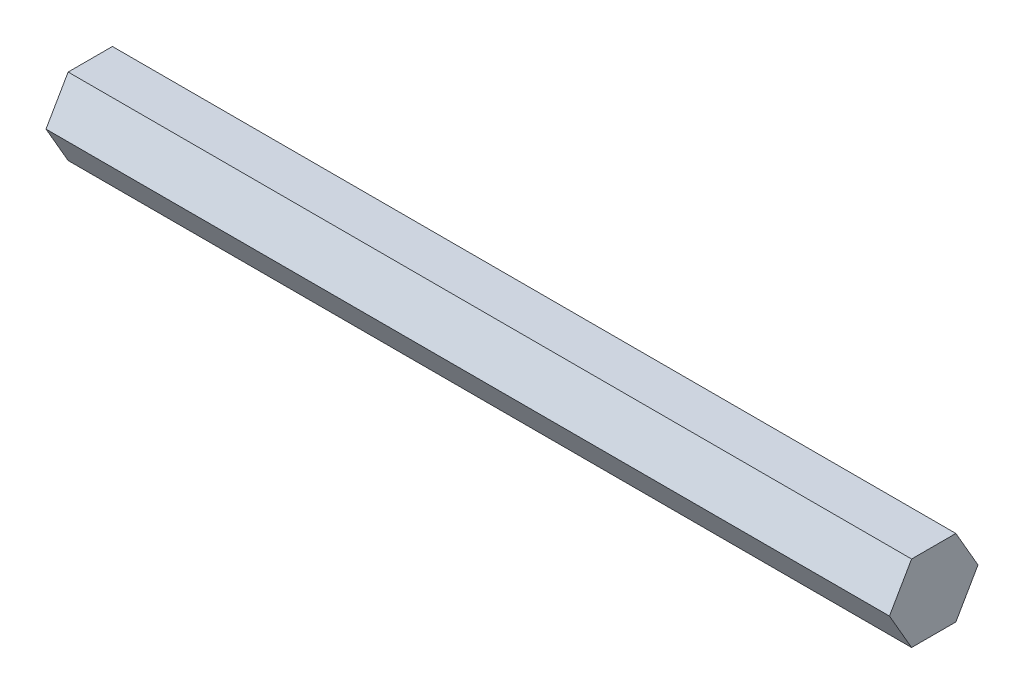
ISO-10303-21;
HEADER;
FILE_DESCRIPTION(('STEP AP214'),'2;1');
FILE_NAME('part.step','',(''),(''),'','','');
FILE_SCHEMA(('AUTOMOTIVE_DESIGN { 1 0 10303 214 1 1 1 1 }'));
ENDSEC;
DATA;
#1=APPLICATION_CONTEXT('core data for automotive mechanical design processes');
#2=APPLICATION_PROTOCOL_DEFINITION('international standard','automotive_design',2000,#1);
#3=PRODUCT_CONTEXT('',#1,'mechanical');
#4=PRODUCT('Part','Part','',(#3));
#5=PRODUCT_RELATED_PRODUCT_CATEGORY('part','',(#4));
#6=PRODUCT_DEFINITION_FORMATION('','',#4);
#7=PRODUCT_DEFINITION_CONTEXT('part definition',#1,'design');
#8=PRODUCT_DEFINITION('design','',#6,#7);
#9=PRODUCT_DEFINITION_SHAPE('','',#8);
#10=(LENGTH_UNIT() NAMED_UNIT(*) SI_UNIT(.MILLI.,.METRE.));
#11=(NAMED_UNIT(*) PLANE_ANGLE_UNIT() SI_UNIT($,.RADIAN.));
#12=(NAMED_UNIT(*) SI_UNIT($,.STERADIAN.) SOLID_ANGLE_UNIT());
#13=UNCERTAINTY_MEASURE_WITH_UNIT(LENGTH_MEASURE(1.E-05),#10,'distance_accuracy_value','');
#14=(GEOMETRIC_REPRESENTATION_CONTEXT(3) GLOBAL_UNCERTAINTY_ASSIGNED_CONTEXT((#13)) GLOBAL_UNIT_ASSIGNED_CONTEXT((#10,
#11,#12)) REPRESENTATION_CONTEXT('',''));
#15=CARTESIAN_POINT('',(0.,0.,0.));
#16=DIRECTION('',(0.,0.,1.));
#17=DIRECTION('',(1.,0.,0.));
#18=AXIS2_PLACEMENT_3D('',#15,#16,#17);
#19=CARTESIAN_POINT('',(69.85,-6.34999999999996,-3.6661742093542));
#20=DIRECTION('',(0.,0.499999999999995,0.866025403784442));
#21=DIRECTION('',(0.,-0.866025403784442,0.499999999999995));
#22=AXIS2_PLACEMENT_3D('',#19,#20,#21);
#23=PLANE('',#22);
#24=DIRECTION('',(0.,0.866025403784441,-0.499999999999995));
#25=VECTOR('',#24,1.);
#26=CARTESIAN_POINT('',(-69.85,-6.34999999999996,-3.6661742093542));
#27=LINE('',#26,#25);
#28=CARTESIAN_POINT('',(-69.85,-6.34999999999996,-3.6661742093542));
#29=VERTEX_POINT('',#28);
#30=CARTESIAN_POINT('',(-69.85,0.,-7.33234841870825));
#31=VERTEX_POINT('',#30);
#32=EDGE_CURVE('E116',#29,#31,#27,.T.);
#33=ORIENTED_EDGE('',*,*,#32,.T.);
#34=DIRECTION('',(-1.,0.,0.));
#35=VECTOR('',#34,1.);
#36=CARTESIAN_POINT('',(69.85,0.,-7.33234841870825));
#37=LINE('',#36,#35);
#38=CARTESIAN_POINT('',(69.85,0.,-7.33234841870825));
#39=VERTEX_POINT('',#38);
#40=EDGE_CURVE('E11',#39,#31,#37,.T.);
#41=ORIENTED_EDGE('',*,*,#40,.F.);
#42=DIRECTION('',(0.,0.866025403784441,-0.499999999999995));
#43=VECTOR('',#42,1.);
#44=CARTESIAN_POINT('',(69.85,-6.34999999999996,-3.6661742093542));
#45=LINE('',#44,#43);
#46=CARTESIAN_POINT('',(69.85,-6.34999999999996,-3.6661742093542));
#47=VERTEX_POINT('',#46);
#48=EDGE_CURVE('E126',#47,#39,#45,.T.);
#49=ORIENTED_EDGE('',*,*,#48,.F.);
#50=DIRECTION('',(-1.,0.,0.));
#51=VECTOR('',#50,1.);
#52=CARTESIAN_POINT('',(69.85,-6.34999999999996,-3.6661742093542));
#53=LINE('',#52,#51);
#54=EDGE_CURVE('E112',#47,#29,#53,.T.);
#55=ORIENTED_EDGE('',*,*,#54,.T.);
#56=EDGE_LOOP('',(#33,#41,#49,#55));
#57=FACE_BOUND('',#56,.T.);
#58=ADVANCED_FACE('F32',(#57),#23,.F.);
#59=CARTESIAN_POINT('',(69.85,0.,-7.33234841870825));
#60=DIRECTION('',(0.,-0.500000000000001,0.866025403784438));
#61=DIRECTION('',(0.,-0.866025403784438,-0.500000000000001));
#62=AXIS2_PLACEMENT_3D('',#59,#60,#61);
#63=PLANE('',#62);
#64=DIRECTION('',(0.,0.866025403784438,0.500000000000001));
#65=VECTOR('',#64,1.);
#66=CARTESIAN_POINT('',(-69.85,0.,-7.33234841870825));
#67=LINE('',#66,#65);
#68=CARTESIAN_POINT('',(-69.85,6.35000000000001,-3.66617420935411));
#69=VERTEX_POINT('',#68);
#70=EDGE_CURVE('E119',#31,#69,#67,.T.);
#71=ORIENTED_EDGE('',*,*,#70,.T.);
#72=DIRECTION('',(-1.,0.,0.));
#73=VECTOR('',#72,1.);
#74=CARTESIAN_POINT('',(69.85,6.35000000000001,-3.66617420935411));
#75=LINE('',#74,#73);
#76=CARTESIAN_POINT('',(69.85,6.35000000000001,-3.66617420935411));
#77=VERTEX_POINT('',#76);
#78=EDGE_CURVE('E40',#77,#69,#75,.T.);
#79=ORIENTED_EDGE('',*,*,#78,.F.);
#80=DIRECTION('',(0.,0.866025403784438,0.500000000000001));
#81=VECTOR('',#80,1.);
#82=CARTESIAN_POINT('',(69.85,0.,-7.33234841870825));
#83=LINE('',#82,#81);
#84=EDGE_CURVE('E85',#39,#77,#83,.T.);
#85=ORIENTED_EDGE('',*,*,#84,.F.);
#86=ORIENTED_EDGE('',*,*,#40,.T.);
#87=EDGE_LOOP('',(#71,#79,#85,#86));
#88=FACE_BOUND('',#87,.T.);
#89=ADVANCED_FACE('F150',(#88),#63,.F.);
#90=CARTESIAN_POINT('',(69.85,6.35000000000001,-3.66617420935411));
#91=DIRECTION('',(0.,-1.,0.));
#92=DIRECTION('',(0.,0.,-1.));
#93=AXIS2_PLACEMENT_3D('',#90,#91,#92);
#94=PLANE('',#93);
#95=DIRECTION('',(0.,0.,1.));
#96=VECTOR('',#95,1.);
#97=CARTESIAN_POINT('',(-69.85,6.35000000000001,-3.66617420935411));
#98=LINE('',#97,#96);
#99=CARTESIAN_POINT('',(-69.85,6.34999999999999,3.66617420935416));
#100=VERTEX_POINT('',#99);
#101=EDGE_CURVE('E121',#69,#100,#98,.T.);
#102=ORIENTED_EDGE('',*,*,#101,.T.);
#103=DIRECTION('',(-1.,0.,0.));
#104=VECTOR('',#103,1.);
#105=CARTESIAN_POINT('',(69.85,6.34999999999999,3.66617420935416));
#106=LINE('',#105,#104);
#107=CARTESIAN_POINT('',(69.85,6.34999999999999,3.66617420935416));
#108=VERTEX_POINT('',#107);
#109=EDGE_CURVE('E107',#108,#100,#106,.T.);
#110=ORIENTED_EDGE('',*,*,#109,.F.);
#111=DIRECTION('',(0.,0.,1.));
#112=VECTOR('',#111,1.);
#113=CARTESIAN_POINT('',(69.85,6.35000000000001,-3.66617420935411));
#114=LINE('',#113,#112);
#115=EDGE_CURVE('E98',#77,#108,#114,.T.);
#116=ORIENTED_EDGE('',*,*,#115,.F.);
#117=ORIENTED_EDGE('',*,*,#78,.T.);
#118=EDGE_LOOP('',(#102,#110,#116,#117));
#119=FACE_BOUND('',#118,.T.);
#120=ADVANCED_FACE('F132',(#119),#94,.F.);
#121=CARTESIAN_POINT('',(69.85,6.34999999999999,3.66617420935416));
#122=DIRECTION('',(0.,-0.499999999999995,-0.866025403784442));
#123=DIRECTION('',(0.,0.866025403784441,-0.499999999999995));
#124=AXIS2_PLACEMENT_3D('',#121,#122,#123);
#125=PLANE('',#124);
#126=DIRECTION('',(0.,-0.866025403784442,0.499999999999995));
#127=VECTOR('',#126,1.);
#128=CARTESIAN_POINT('',(-69.85,6.34999999999999,3.66617420935416));
#129=LINE('',#128,#127);
#130=CARTESIAN_POINT('',(-69.85,0.,7.33234841870825));
#131=VERTEX_POINT('',#130);
#132=EDGE_CURVE('E106',#100,#131,#129,.T.);
#133=ORIENTED_EDGE('',*,*,#132,.T.);
#134=DIRECTION('',(-1.,0.,0.));
#135=VECTOR('',#134,1.);
#136=CARTESIAN_POINT('',(69.85,0.,7.33234841870825));
#137=LINE('',#136,#135);
#138=CARTESIAN_POINT('',(69.85,0.,7.33234841870825));
#139=VERTEX_POINT('',#138);
#140=EDGE_CURVE('E103',#139,#131,#137,.T.);
#141=ORIENTED_EDGE('',*,*,#140,.F.);
#142=DIRECTION('',(0.,-0.866025403784442,0.499999999999995));
#143=VECTOR('',#142,1.);
#144=CARTESIAN_POINT('',(69.85,6.34999999999999,3.66617420935416));
#145=LINE('',#144,#143);
#146=EDGE_CURVE('E92',#108,#139,#145,.T.);
#147=ORIENTED_EDGE('',*,*,#146,.F.);
#148=ORIENTED_EDGE('',*,*,#109,.T.);
#149=EDGE_LOOP('',(#133,#141,#147,#148));
#150=FACE_BOUND('',#149,.T.);
#151=ADVANCED_FACE('F104',(#150),#125,.F.);
#152=CARTESIAN_POINT('',(69.85,0.,7.33234841870825));
#153=DIRECTION('',(0.,0.500000000000007,-0.866025403784435));
#154=DIRECTION('',(0.,0.866025403784435,0.500000000000007));
#155=AXIS2_PLACEMENT_3D('',#152,#153,#154);
#156=PLANE('',#155);
#157=DIRECTION('',(0.,-0.866025403784435,-0.500000000000007));
#158=VECTOR('',#157,1.);
#159=CARTESIAN_POINT('',(-69.85,0.,7.33234841870825));
#160=LINE('',#159,#158);
#161=CARTESIAN_POINT('',(-69.85,-6.35000000000004,3.66617420935407));
#162=VERTEX_POINT('',#161);
#163=EDGE_CURVE('E71',#131,#162,#160,.T.);
#164=ORIENTED_EDGE('',*,*,#163,.T.);
#165=DIRECTION('',(-1.,0.,0.));
#166=VECTOR('',#165,1.);
#167=CARTESIAN_POINT('',(69.85,-6.35000000000004,3.66617420935407));
#168=LINE('',#167,#166);
#169=CARTESIAN_POINT('',(69.85,-6.35000000000004,3.66617420935407));
#170=VERTEX_POINT('',#169);
#171=EDGE_CURVE('E108',#170,#162,#168,.T.);
#172=ORIENTED_EDGE('',*,*,#171,.F.);
#173=DIRECTION('',(0.,-0.866025403784435,-0.500000000000007));
#174=VECTOR('',#173,1.);
#175=CARTESIAN_POINT('',(69.85,0.,7.33234841870825));
#176=LINE('',#175,#174);
#177=EDGE_CURVE('E96',#139,#170,#176,.T.);
#178=ORIENTED_EDGE('',*,*,#177,.F.);
#179=ORIENTED_EDGE('',*,*,#140,.T.);
#180=EDGE_LOOP('',(#164,#172,#178,#179));
#181=FACE_BOUND('',#180,.T.);
#182=ADVANCED_FACE('F110',(#181),#156,.F.);
#183=CARTESIAN_POINT('',(69.85,-6.35000000000004,3.66617420935407));
#184=DIRECTION('',(0.,1.,0.));
#185=DIRECTION('',(0.,0.,1.));
#186=AXIS2_PLACEMENT_3D('',#183,#184,#185);
#187=PLANE('',#186);
#188=DIRECTION('',(0.,0.,-1.));
#189=VECTOR('',#188,1.);
#190=CARTESIAN_POINT('',(-69.85,-6.35000000000004,3.66617420935407));
#191=LINE('',#190,#189);
#192=EDGE_CURVE('E77',#162,#29,#191,.T.);
#193=ORIENTED_EDGE('',*,*,#192,.T.);
#194=ORIENTED_EDGE('',*,*,#54,.F.);
#195=DIRECTION('',(0.,0.,-1.));
#196=VECTOR('',#195,1.);
#197=CARTESIAN_POINT('',(69.85,-6.35000000000004,3.66617420935407));
#198=LINE('',#197,#196);
#199=EDGE_CURVE('E48',#170,#47,#198,.T.);
#200=ORIENTED_EDGE('',*,*,#199,.F.);
#201=ORIENTED_EDGE('',*,*,#171,.T.);
#202=EDGE_LOOP('',(#193,#194,#200,#201));
#203=FACE_BOUND('',#202,.T.);
#204=ADVANCED_FACE('F139',(#203),#187,.F.);
#205=CARTESIAN_POINT('',(69.85,0.,0.));
#206=DIRECTION('',(1.,0.,0.));
#207=DIRECTION('',(0.,0.,-1.));
#208=AXIS2_PLACEMENT_3D('',#205,#206,#207);
#209=PLANE('',#208);
#210=ORIENTED_EDGE('',*,*,#48,.T.);
#211=ORIENTED_EDGE('',*,*,#84,.T.);
#212=ORIENTED_EDGE('',*,*,#115,.T.);
#213=ORIENTED_EDGE('',*,*,#146,.T.);
#214=ORIENTED_EDGE('',*,*,#177,.T.);
#215=ORIENTED_EDGE('',*,*,#199,.T.);
#216=EDGE_LOOP('',(#210,#211,#212,#213,#214,#215));
#217=FACE_BOUND('',#216,.T.);
#218=ADVANCED_FACE('F94',(#217),#209,.T.);
#219=CARTESIAN_POINT('',(-69.85,0.,0.));
#220=DIRECTION('',(1.,0.,0.));
#221=DIRECTION('',(0.,0.,-1.));
#222=AXIS2_PLACEMENT_3D('',#219,#220,#221);
#223=PLANE('',#222);
#224=ORIENTED_EDGE('',*,*,#32,.F.);
#225=ORIENTED_EDGE('',*,*,#192,.F.);
#226=ORIENTED_EDGE('',*,*,#163,.F.);
#227=ORIENTED_EDGE('',*,*,#132,.F.);
#228=ORIENTED_EDGE('',*,*,#101,.F.);
#229=ORIENTED_EDGE('',*,*,#70,.F.);
#230=EDGE_LOOP('',(#224,#225,#226,#227,#228,#229));
#231=FACE_BOUND('',#230,.T.);
#232=ADVANCED_FACE('F135',(#231),#223,.F.);
#233=CLOSED_SHELL('',(#58,#89,#120,#151,#182,#204,#218,#232));
#234=MANIFOLD_SOLID_BREP('B2',#233);
#235=ADVANCED_BREP_SHAPE_REPRESENTATION('',(#18,#234),#14);
#236=SHAPE_DEFINITION_REPRESENTATION(#9,#235);
ENDSEC;
END-ISO-10303-21;
